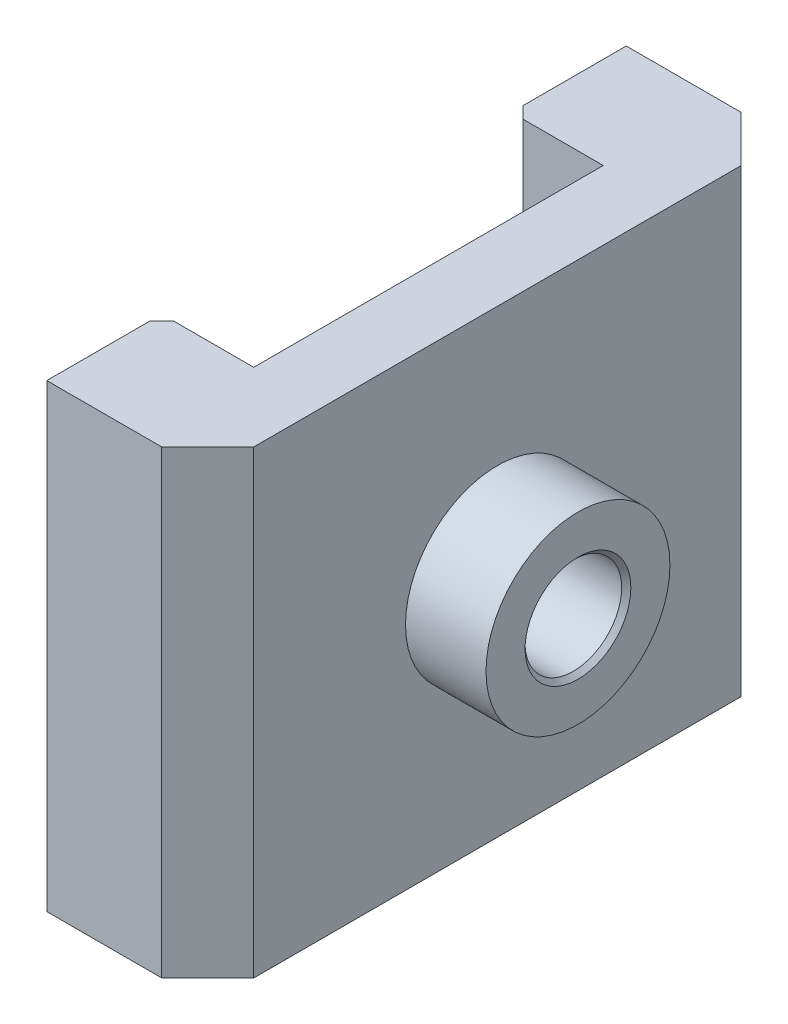
ISO-10303-21;
HEADER;
FILE_DESCRIPTION(('STEP AP214'),'2;1');
FILE_NAME('part.step','',(''),(''),'','','');
FILE_SCHEMA(('AUTOMOTIVE_DESIGN { 1 0 10303 214 1 1 1 1 }'));
ENDSEC;
DATA;
#1=APPLICATION_CONTEXT('core data for automotive mechanical design processes');
#2=APPLICATION_PROTOCOL_DEFINITION('international standard','automotive_design',2000,#1);
#3=PRODUCT_CONTEXT('',#1,'mechanical');
#4=PRODUCT('Part','Part','',(#3));
#5=PRODUCT_RELATED_PRODUCT_CATEGORY('part','',(#4));
#6=PRODUCT_DEFINITION_FORMATION('','',#4);
#7=PRODUCT_DEFINITION_CONTEXT('part definition',#1,'design');
#8=PRODUCT_DEFINITION('design','',#6,#7);
#9=PRODUCT_DEFINITION_SHAPE('','',#8);
#10=(LENGTH_UNIT() NAMED_UNIT(*) SI_UNIT(.MILLI.,.METRE.));
#11=(NAMED_UNIT(*) PLANE_ANGLE_UNIT() SI_UNIT($,.RADIAN.));
#12=(NAMED_UNIT(*) SI_UNIT($,.STERADIAN.) SOLID_ANGLE_UNIT());
#13=UNCERTAINTY_MEASURE_WITH_UNIT(LENGTH_MEASURE(1.E-05),#10,'distance_accuracy_value','');
#14=(GEOMETRIC_REPRESENTATION_CONTEXT(3) GLOBAL_UNCERTAINTY_ASSIGNED_CONTEXT((#13)) GLOBAL_UNIT_ASSIGNED_CONTEXT((#10,
#11,#12)) REPRESENTATION_CONTEXT('',''));
#15=CARTESIAN_POINT('',(0.,0.,0.));
#16=DIRECTION('',(0.,0.,1.));
#17=DIRECTION('',(1.,0.,0.));
#18=AXIS2_PLACEMENT_3D('',#15,#16,#17);
#19=CARTESIAN_POINT('',(-7.,20.,-7.6));
#20=DIRECTION('',(1.,0.,0.));
#21=DIRECTION('',(0.,0.,-1.));
#22=AXIS2_PLACEMENT_3D('',#19,#20,#21);
#23=PLANE('',#22);
#24=DIRECTION('',(0.,0.,1.));
#25=VECTOR('',#24,1.);
#26=CARTESIAN_POINT('',(-7.,0.,-7.6));
#27=LINE('',#26,#25);
#28=CARTESIAN_POINT('',(-7.,0.,-12.6));
#29=VERTEX_POINT('',#28);
#30=CARTESIAN_POINT('',(-7.,0.,-8.1));
#31=VERTEX_POINT('',#30);
#32=EDGE_CURVE('E164',#29,#31,#27,.T.);
#33=ORIENTED_EDGE('',*,*,#32,.T.);
#34=DIRECTION('',(0.,1.,0.));
#35=VECTOR('',#34,1.);
#36=CARTESIAN_POINT('',(-7.,20.,-8.1));
#37=LINE('',#36,#35);
#38=CARTESIAN_POINT('',(-7.,20.,-8.1));
#39=VERTEX_POINT('',#38);
#40=EDGE_CURVE('E221',#31,#39,#37,.T.);
#41=ORIENTED_EDGE('',*,*,#40,.T.);
#42=DIRECTION('',(0.,0.,1.));
#43=VECTOR('',#42,1.);
#44=CARTESIAN_POINT('',(-7.,20.,-7.6));
#45=LINE('',#44,#43);
#46=CARTESIAN_POINT('',(-7.,20.,-12.6));
#47=VERTEX_POINT('',#46);
#48=EDGE_CURVE('E134',#47,#39,#45,.T.);
#49=ORIENTED_EDGE('',*,*,#48,.F.);
#50=DIRECTION('',(0.,-1.,0.));
#51=VECTOR('',#50,1.);
#52=CARTESIAN_POINT('',(-7.,20.,-12.6));
#53=LINE('',#52,#51);
#54=EDGE_CURVE('E163',#47,#29,#53,.T.);
#55=ORIENTED_EDGE('',*,*,#54,.T.);
#56=EDGE_LOOP('',(#33,#41,#49,#55));
#57=FACE_BOUND('',#56,.T.);
#58=ADVANCED_FACE('F35',(#57),#23,.F.);
#59=CARTESIAN_POINT('',(-3.,20.,-7.6));
#60=DIRECTION('',(0.,0.,-1.));
#61=DIRECTION('',(-1.,0.,0.));
#62=AXIS2_PLACEMENT_3D('',#59,#60,#61);
#63=PLANE('',#62);
#64=DIRECTION('',(1.,0.,0.));
#65=VECTOR('',#64,1.);
#66=CARTESIAN_POINT('',(-3.,20.,-7.6));
#67=LINE('',#66,#65);
#68=CARTESIAN_POINT('',(-6.49999999999999,20.,-7.6));
#69=VERTEX_POINT('',#68);
#70=CARTESIAN_POINT('',(-3.,20.,-7.6));
#71=VERTEX_POINT('',#70);
#72=EDGE_CURVE('E122',#69,#71,#67,.T.);
#73=ORIENTED_EDGE('',*,*,#72,.F.);
#74=DIRECTION('',(0.,-1.,0.));
#75=VECTOR('',#74,1.);
#76=CARTESIAN_POINT('',(-6.49999999999999,20.,-7.6));
#77=LINE('',#76,#75);
#78=CARTESIAN_POINT('',(-6.49999999999999,0.,-7.6));
#79=VERTEX_POINT('',#78);
#80=EDGE_CURVE('E215',#69,#79,#77,.T.);
#81=ORIENTED_EDGE('',*,*,#80,.T.);
#82=DIRECTION('',(1.,0.,0.));
#83=VECTOR('',#82,1.);
#84=CARTESIAN_POINT('',(-3.,0.,-7.6));
#85=LINE('',#84,#83);
#86=CARTESIAN_POINT('',(-3.,0.,-7.6));
#87=VERTEX_POINT('',#86);
#88=EDGE_CURVE('E140',#79,#87,#85,.T.);
#89=ORIENTED_EDGE('',*,*,#88,.T.);
#90=DIRECTION('',(0.,-1.,0.));
#91=VECTOR('',#90,1.);
#92=CARTESIAN_POINT('',(-3.,20.,-7.6));
#93=LINE('',#92,#91);
#94=EDGE_CURVE('E137',#71,#87,#93,.T.);
#95=ORIENTED_EDGE('',*,*,#94,.F.);
#96=EDGE_LOOP('',(#73,#81,#89,#95));
#97=FACE_BOUND('',#96,.T.);
#98=ADVANCED_FACE('F138',(#97),#63,.F.);
#99=CARTESIAN_POINT('',(-3.,20.,7.6));
#100=DIRECTION('',(1.,0.,0.));
#101=DIRECTION('',(0.,0.,-1.));
#102=AXIS2_PLACEMENT_3D('',#99,#100,#101);
#103=PLANE('',#102);
#104=CARTESIAN_POINT('',(-3.,10.,0.));
#105=DIRECTION('',(1.,0.,0.));
#106=DIRECTION('',(0.,0.,-1.));
#107=AXIS2_PLACEMENT_3D('',#104,#105,#106);
#108=CIRCLE('',#107,2.1);
#109=CARTESIAN_POINT('',(-3.,10.,-2.1));
#110=VERTEX_POINT('',#109);
#111=EDGE_CURVE('E264',#110,#110,#108,.T.);
#112=ORIENTED_EDGE('',*,*,#111,.T.);
#113=EDGE_LOOP('',(#112));
#114=FACE_BOUND('',#113,.T.);
#115=DIRECTION('',(0.,0.,1.));
#116=VECTOR('',#115,1.);
#117=CARTESIAN_POINT('',(-3.,0.,7.6));
#118=LINE('',#117,#116);
#119=CARTESIAN_POINT('',(-3.,0.,7.6));
#120=VERTEX_POINT('',#119);
#121=EDGE_CURVE('E169',#87,#120,#118,.T.);
#122=ORIENTED_EDGE('',*,*,#121,.T.);
#123=DIRECTION('',(0.,-1.,0.));
#124=VECTOR('',#123,1.);
#125=CARTESIAN_POINT('',(-3.,20.,7.6));
#126=LINE('',#125,#124);
#127=CARTESIAN_POINT('',(-3.,20.,7.6));
#128=VERTEX_POINT('',#127);
#129=EDGE_CURVE('E144',#128,#120,#126,.T.);
#130=ORIENTED_EDGE('',*,*,#129,.F.);
#131=DIRECTION('',(0.,0.,1.));
#132=VECTOR('',#131,1.);
#133=CARTESIAN_POINT('',(-3.,20.,7.6));
#134=LINE('',#133,#132);
#135=EDGE_CURVE('E127',#71,#128,#134,.T.);
#136=ORIENTED_EDGE('',*,*,#135,.F.);
#137=ORIENTED_EDGE('',*,*,#94,.T.);
#138=EDGE_LOOP('',(#122,#130,#136,#137));
#139=FACE_BOUND('',#138,.T.);
#140=ADVANCED_FACE('F146',(#114,#139),#103,.F.);
#141=CARTESIAN_POINT('',(-7.,20.,7.6));
#142=DIRECTION('',(0.,0.,1.));
#143=DIRECTION('',(1.,0.,0.));
#144=AXIS2_PLACEMENT_3D('',#141,#142,#143);
#145=PLANE('',#144);
#146=DIRECTION('',(-1.,0.,0.));
#147=VECTOR('',#146,1.);
#148=CARTESIAN_POINT('',(-7.,0.,7.6));
#149=LINE('',#148,#147);
#150=CARTESIAN_POINT('',(-6.49999999999999,0.,7.6));
#151=VERTEX_POINT('',#150);
#152=EDGE_CURVE('E171',#120,#151,#149,.T.);
#153=ORIENTED_EDGE('',*,*,#152,.T.);
#154=DIRECTION('',(0.,1.,0.));
#155=VECTOR('',#154,1.);
#156=CARTESIAN_POINT('',(-6.49999999999999,20.,7.6));
#157=LINE('',#156,#155);
#158=CARTESIAN_POINT('',(-6.49999999999999,20.,7.6));
#159=VERTEX_POINT('',#158);
#160=EDGE_CURVE('E11',#151,#159,#157,.T.);
#161=ORIENTED_EDGE('',*,*,#160,.T.);
#162=DIRECTION('',(-1.,0.,0.));
#163=VECTOR('',#162,1.);
#164=CARTESIAN_POINT('',(-7.,20.,7.6));
#165=LINE('',#164,#163);
#166=EDGE_CURVE('E148',#128,#159,#165,.T.);
#167=ORIENTED_EDGE('',*,*,#166,.F.);
#168=ORIENTED_EDGE('',*,*,#129,.T.);
#169=EDGE_LOOP('',(#153,#161,#167,#168));
#170=FACE_BOUND('',#169,.T.);
#171=ADVANCED_FACE('F301',(#170),#145,.F.);
#172=CARTESIAN_POINT('',(-7.,20.,12.6));
#173=DIRECTION('',(1.,0.,0.));
#174=DIRECTION('',(0.,0.,-1.));
#175=AXIS2_PLACEMENT_3D('',#172,#173,#174);
#176=PLANE('',#175);
#177=DIRECTION('',(0.,0.,1.));
#178=VECTOR('',#177,1.);
#179=CARTESIAN_POINT('',(-7.,20.,12.6));
#180=LINE('',#179,#178);
#181=CARTESIAN_POINT('',(-7.,20.,8.10000000000001));
#182=VERTEX_POINT('',#181);
#183=CARTESIAN_POINT('',(-7.,20.,12.6));
#184=VERTEX_POINT('',#183);
#185=EDGE_CURVE('E150',#182,#184,#180,.T.);
#186=ORIENTED_EDGE('',*,*,#185,.F.);
#187=DIRECTION('',(0.,-1.,0.));
#188=VECTOR('',#187,1.);
#189=CARTESIAN_POINT('',(-7.,20.,8.10000000000001));
#190=LINE('',#189,#188);
#191=CARTESIAN_POINT('',(-7.,0.,8.10000000000001));
#192=VERTEX_POINT('',#191);
#193=EDGE_CURVE('E43',#182,#192,#190,.T.);
#194=ORIENTED_EDGE('',*,*,#193,.T.);
#195=DIRECTION('',(0.,0.,1.));
#196=VECTOR('',#195,1.);
#197=CARTESIAN_POINT('',(-7.,0.,12.6));
#198=LINE('',#197,#196);
#199=CARTESIAN_POINT('',(-7.,0.,12.6));
#200=VERTEX_POINT('',#199);
#201=EDGE_CURVE('E173',#192,#200,#198,.T.);
#202=ORIENTED_EDGE('',*,*,#201,.T.);
#203=DIRECTION('',(0.,-1.,0.));
#204=VECTOR('',#203,1.);
#205=CARTESIAN_POINT('',(-7.,20.,12.6));
#206=LINE('',#205,#204);
#207=EDGE_CURVE('E185',#184,#200,#206,.T.);
#208=ORIENTED_EDGE('',*,*,#207,.F.);
#209=EDGE_LOOP('',(#186,#194,#202,#208));
#210=FACE_BOUND('',#209,.T.);
#211=ADVANCED_FACE('F228',(#210),#176,.F.);
#212=CARTESIAN_POINT('',(0.,20.,12.6));
#213=DIRECTION('',(0.,0.,-1.));
#214=DIRECTION('',(-1.,0.,0.));
#215=AXIS2_PLACEMENT_3D('',#212,#213,#214);
#216=PLANE('',#215);
#217=DIRECTION('',(1.,0.,0.));
#218=VECTOR('',#217,1.);
#219=CARTESIAN_POINT('',(0.,0.,12.6));
#220=LINE('',#219,#218);
#221=CARTESIAN_POINT('',(-2.00000000000001,0.,12.6));
#222=VERTEX_POINT('',#221);
#223=EDGE_CURVE('E175',#200,#222,#220,.T.);
#224=ORIENTED_EDGE('',*,*,#223,.T.);
#225=DIRECTION('',(0.,1.,0.));
#226=VECTOR('',#225,1.);
#227=CARTESIAN_POINT('',(-2.00000000000001,20.,12.6));
#228=LINE('',#227,#226);
#229=CARTESIAN_POINT('',(-2.00000000000001,20.,12.6));
#230=VERTEX_POINT('',#229);
#231=EDGE_CURVE('E204',#222,#230,#228,.T.);
#232=ORIENTED_EDGE('',*,*,#231,.T.);
#233=DIRECTION('',(1.,0.,0.));
#234=VECTOR('',#233,1.);
#235=CARTESIAN_POINT('',(0.,20.,12.6));
#236=LINE('',#235,#234);
#237=EDGE_CURVE('E155',#184,#230,#236,.T.);
#238=ORIENTED_EDGE('',*,*,#237,.F.);
#239=ORIENTED_EDGE('',*,*,#207,.T.);
#240=EDGE_LOOP('',(#224,#232,#238,#239));
#241=FACE_BOUND('',#240,.T.);
#242=ADVANCED_FACE('F238',(#241),#216,.F.);
#243=CARTESIAN_POINT('',(0.,20.,-12.6));
#244=DIRECTION('',(-1.,0.,0.));
#245=DIRECTION('',(0.,0.,1.));
#246=AXIS2_PLACEMENT_3D('',#243,#244,#245);
#247=PLANE('',#246);
#248=CARTESIAN_POINT('',(0.,10.,0.));
#249=DIRECTION('',(-1.,0.,0.));
#250=DIRECTION('',(0.,0.,1.));
#251=AXIS2_PLACEMENT_3D('',#248,#249,#250);
#252=CIRCLE('',#251,4.);
#253=CARTESIAN_POINT('',(0.,10.,4.));
#254=VERTEX_POINT('',#253);
#255=EDGE_CURVE('E206',#254,#254,#252,.F.);
#256=ORIENTED_EDGE('',*,*,#255,.F.);
#257=EDGE_LOOP('',(#256));
#258=FACE_BOUND('',#257,.T.);
#259=DIRECTION('',(0.,0.,-1.));
#260=VECTOR('',#259,1.);
#261=CARTESIAN_POINT('',(0.,0.,-12.6));
#262=LINE('',#261,#260);
#263=CARTESIAN_POINT('',(0.,0.,10.6));
#264=VERTEX_POINT('',#263);
#265=CARTESIAN_POINT('',(0.,0.,-10.6));
#266=VERTEX_POINT('',#265);
#267=EDGE_CURVE('E178',#264,#266,#262,.T.);
#268=ORIENTED_EDGE('',*,*,#267,.T.);
#269=DIRECTION('',(0.,1.,0.));
#270=VECTOR('',#269,1.);
#271=CARTESIAN_POINT('',(0.,20.,-10.6));
#272=LINE('',#271,#270);
#273=CARTESIAN_POINT('',(0.,20.,-10.6));
#274=VERTEX_POINT('',#273);
#275=EDGE_CURVE('E198',#266,#274,#272,.T.);
#276=ORIENTED_EDGE('',*,*,#275,.T.);
#277=DIRECTION('',(0.,0.,-1.));
#278=VECTOR('',#277,1.);
#279=CARTESIAN_POINT('',(0.,20.,-12.6));
#280=LINE('',#279,#278);
#281=CARTESIAN_POINT('',(0.,20.,10.6));
#282=VERTEX_POINT('',#281);
#283=EDGE_CURVE('E158',#282,#274,#280,.T.);
#284=ORIENTED_EDGE('',*,*,#283,.F.);
#285=DIRECTION('',(0.,-1.,0.));
#286=VECTOR('',#285,1.);
#287=CARTESIAN_POINT('',(0.,20.,10.6));
#288=LINE('',#287,#286);
#289=EDGE_CURVE('E195',#282,#264,#288,.T.);
#290=ORIENTED_EDGE('',*,*,#289,.T.);
#291=EDGE_LOOP('',(#268,#276,#284,#290));
#292=FACE_BOUND('',#291,.T.);
#293=ADVANCED_FACE('F247',(#258,#292),#247,.F.);
#294=CARTESIAN_POINT('',(-7.,20.,-12.6));
#295=DIRECTION('',(0.,0.,1.));
#296=DIRECTION('',(1.,0.,0.));
#297=AXIS2_PLACEMENT_3D('',#294,#295,#296);
#298=PLANE('',#297);
#299=DIRECTION('',(-1.,0.,0.));
#300=VECTOR('',#299,1.);
#301=CARTESIAN_POINT('',(-7.,20.,-12.6));
#302=LINE('',#301,#300);
#303=CARTESIAN_POINT('',(-2.,20.,-12.6));
#304=VERTEX_POINT('',#303);
#305=EDGE_CURVE('E161',#304,#47,#302,.T.);
#306=ORIENTED_EDGE('',*,*,#305,.F.);
#307=DIRECTION('',(0.,-1.,0.));
#308=VECTOR('',#307,1.);
#309=CARTESIAN_POINT('',(-2.,20.,-12.6));
#310=LINE('',#309,#308);
#311=CARTESIAN_POINT('',(-2.,0.,-12.6));
#312=VERTEX_POINT('',#311);
#313=EDGE_CURVE('E143',#304,#312,#310,.T.);
#314=ORIENTED_EDGE('',*,*,#313,.T.);
#315=DIRECTION('',(-1.,0.,0.));
#316=VECTOR('',#315,1.);
#317=CARTESIAN_POINT('',(-7.,0.,-12.6));
#318=LINE('',#317,#316);
#319=EDGE_CURVE('E181',#312,#29,#318,.T.);
#320=ORIENTED_EDGE('',*,*,#319,.T.);
#321=ORIENTED_EDGE('',*,*,#54,.F.);
#322=EDGE_LOOP('',(#306,#314,#320,#321));
#323=FACE_BOUND('',#322,.T.);
#324=ADVANCED_FACE('F255',(#323),#298,.F.);
#325=CARTESIAN_POINT('',(0.,20.,0.));
#326=DIRECTION('',(0.,-1.,0.));
#327=DIRECTION('',(0.,0.,-1.));
#328=AXIS2_PLACEMENT_3D('',#325,#326,#327);
#329=PLANE('',#328);
#330=ORIENTED_EDGE('',*,*,#48,.T.);
#331=DIRECTION('',(-0.707106781186548,0.,-0.707106781186547));
#332=VECTOR('',#331,1.);
#333=CARTESIAN_POINT('',(-6.49999999999999,20.,-7.6));
#334=LINE('',#333,#332);
#335=EDGE_CURVE('E130',#39,#69,#334,.F.);
#336=ORIENTED_EDGE('',*,*,#335,.T.);
#337=ORIENTED_EDGE('',*,*,#72,.T.);
#338=ORIENTED_EDGE('',*,*,#135,.T.);
#339=ORIENTED_EDGE('',*,*,#166,.T.);
#340=DIRECTION('',(0.707106781186548,0.,-0.707106781186547));
#341=VECTOR('',#340,1.);
#342=CARTESIAN_POINT('',(-7.,20.,8.10000000000001));
#343=LINE('',#342,#341);
#344=EDGE_CURVE('E50',#159,#182,#343,.F.);
#345=ORIENTED_EDGE('',*,*,#344,.T.);
#346=ORIENTED_EDGE('',*,*,#185,.T.);
#347=ORIENTED_EDGE('',*,*,#237,.T.);
#348=DIRECTION('',(-0.707106781186548,0.,0.707106781186547));
#349=VECTOR('',#348,1.);
#350=CARTESIAN_POINT('',(0.,20.,10.6));
#351=LINE('',#350,#349);
#352=EDGE_CURVE('E200',#230,#282,#351,.F.);
#353=ORIENTED_EDGE('',*,*,#352,.T.);
#354=ORIENTED_EDGE('',*,*,#283,.T.);
#355=DIRECTION('',(0.707106781186547,0.,0.707106781186548));
#356=VECTOR('',#355,1.);
#357=CARTESIAN_POINT('',(-2.,20.,-12.6));
#358=LINE('',#357,#356);
#359=EDGE_CURVE('E202',#274,#304,#358,.F.);
#360=ORIENTED_EDGE('',*,*,#359,.T.);
#361=ORIENTED_EDGE('',*,*,#305,.T.);
#362=EDGE_LOOP('',(#330,#336,#337,#338,#339,#345,#346,#347,#353,#354,#360,#361));
#363=FACE_BOUND('',#362,.T.);
#364=ADVANCED_FACE('F125',(#363),#329,.F.);
#365=CARTESIAN_POINT('',(0.,0.,0.));
#366=DIRECTION('',(0.,-1.,0.));
#367=DIRECTION('',(0.,0.,-1.));
#368=AXIS2_PLACEMENT_3D('',#365,#366,#367);
#369=PLANE('',#368);
#370=ORIENTED_EDGE('',*,*,#88,.F.);
#371=DIRECTION('',(0.707106781186548,0.,0.707106781186547));
#372=VECTOR('',#371,1.);
#373=CARTESIAN_POINT('',(0.550000000000009,0.,-0.55000000000001));
#374=LINE('',#373,#372);
#375=EDGE_CURVE('E219',#79,#31,#374,.F.);
#376=ORIENTED_EDGE('',*,*,#375,.T.);
#377=ORIENTED_EDGE('',*,*,#32,.F.);
#378=ORIENTED_EDGE('',*,*,#319,.F.);
#379=DIRECTION('',(-0.707106781186547,0.,-0.707106781186548));
#380=VECTOR('',#379,1.);
#381=CARTESIAN_POINT('',(5.3,0.,-5.29999999999999));
#382=LINE('',#381,#380);
#383=EDGE_CURVE('E193',#312,#266,#382,.F.);
#384=ORIENTED_EDGE('',*,*,#383,.T.);
#385=ORIENTED_EDGE('',*,*,#267,.F.);
#386=DIRECTION('',(0.707106781186548,0.,-0.707106781186547));
#387=VECTOR('',#386,1.);
#388=CARTESIAN_POINT('',(5.3,0.,5.30000000000001));
#389=LINE('',#388,#387);
#390=EDGE_CURVE('E191',#264,#222,#389,.F.);
#391=ORIENTED_EDGE('',*,*,#390,.T.);
#392=ORIENTED_EDGE('',*,*,#223,.F.);
#393=ORIENTED_EDGE('',*,*,#201,.F.);
#394=DIRECTION('',(-0.707106781186548,0.,0.707106781186547));
#395=VECTOR('',#394,1.);
#396=CARTESIAN_POINT('',(0.550000000000011,0.,0.550000000000011));
#397=LINE('',#396,#395);
#398=EDGE_CURVE('E217',#192,#151,#397,.F.);
#399=ORIENTED_EDGE('',*,*,#398,.T.);
#400=ORIENTED_EDGE('',*,*,#152,.F.);
#401=ORIENTED_EDGE('',*,*,#121,.F.);
#402=EDGE_LOOP('',(#370,#376,#377,#378,#384,#385,#391,#392,#393,#399,#400,#401));
#403=FACE_BOUND('',#402,.T.);
#404=ADVANCED_FACE('F233',(#403),#369,.T.);
#405=CARTESIAN_POINT('',(-2.,20.,-12.6));
#406=DIRECTION('',(-0.707106781186548,0.,0.707106781186547));
#407=DIRECTION('',(0.,-1.,0.));
#408=AXIS2_PLACEMENT_3D('',#405,#406,#407);
#409=PLANE('',#408);
#410=ORIENTED_EDGE('',*,*,#359,.F.);
#411=ORIENTED_EDGE('',*,*,#275,.F.);
#412=ORIENTED_EDGE('',*,*,#383,.F.);
#413=ORIENTED_EDGE('',*,*,#313,.F.);
#414=EDGE_LOOP('',(#410,#411,#412,#413));
#415=FACE_BOUND('',#414,.T.);
#416=ADVANCED_FACE('F250',(#415),#409,.F.);
#417=CARTESIAN_POINT('',(0.,20.,10.6));
#418=DIRECTION('',(-0.707106781186547,0.,-0.707106781186548));
#419=DIRECTION('',(0.,-1.,0.));
#420=AXIS2_PLACEMENT_3D('',#417,#418,#419);
#421=PLANE('',#420);
#422=ORIENTED_EDGE('',*,*,#352,.F.);
#423=ORIENTED_EDGE('',*,*,#231,.F.);
#424=ORIENTED_EDGE('',*,*,#390,.F.);
#425=ORIENTED_EDGE('',*,*,#289,.F.);
#426=EDGE_LOOP('',(#422,#423,#424,#425));
#427=FACE_BOUND('',#426,.T.);
#428=ADVANCED_FACE('F242',(#427),#421,.F.);
#429=CARTESIAN_POINT('',(3.5,10.,0.));
#430=DIRECTION('',(-1.,0.,0.));
#431=DIRECTION('',(0.,0.,1.));
#432=AXIS2_PLACEMENT_3D('',#429,#430,#431);
#433=CYLINDRICAL_SURFACE('',#432,4.);
#434=CARTESIAN_POINT('',(3.5,10.,0.));
#435=DIRECTION('',(1.,0.,0.));
#436=DIRECTION('',(0.,0.,-1.));
#437=AXIS2_PLACEMENT_3D('',#434,#435,#436);
#438=CIRCLE('',#437,4.);
#439=CARTESIAN_POINT('',(3.5,10.,-4.));
#440=VERTEX_POINT('',#439);
#441=EDGE_CURVE('E167',#440,#440,#438,.T.);
#442=ORIENTED_EDGE('',*,*,#441,.F.);
#443=EDGE_LOOP('',(#442));
#444=FACE_BOUND('',#443,.T.);
#445=ORIENTED_EDGE('',*,*,#255,.T.);
#446=EDGE_LOOP('',(#445));
#447=FACE_BOUND('',#446,.T.);
#448=ADVANCED_FACE('F282',(#444,#447),#433,.T.);
#449=CARTESIAN_POINT('',(3.5,10.,0.));
#450=DIRECTION('',(1.,0.,0.));
#451=DIRECTION('',(0.,0.,-1.));
#452=AXIS2_PLACEMENT_3D('',#449,#450,#451);
#453=PLANE('',#452);
#454=CARTESIAN_POINT('',(3.5,10.,0.));
#455=DIRECTION('',(1.,0.,0.));
#456=DIRECTION('',(0.,0.,-1.));
#457=AXIS2_PLACEMENT_3D('',#454,#455,#456);
#458=CIRCLE('',#457,2.3);
#459=CARTESIAN_POINT('',(3.5,10.,-2.3));
#460=VERTEX_POINT('',#459);
#461=EDGE_CURVE('E212',#460,#460,#458,.F.);
#462=ORIENTED_EDGE('',*,*,#461,.T.);
#463=EDGE_LOOP('',(#462));
#464=FACE_BOUND('',#463,.T.);
#465=ORIENTED_EDGE('',*,*,#441,.T.);
#466=EDGE_LOOP('',(#465));
#467=FACE_BOUND('',#466,.T.);
#468=ADVANCED_FACE('F272',(#464,#467),#453,.T.);
#469=CARTESIAN_POINT('',(-7.,10.,0.));
#470=DIRECTION('',(1.,0.,0.));
#471=DIRECTION('',(0.,0.,-1.));
#472=AXIS2_PLACEMENT_3D('',#469,#470,#471);
#473=CYLINDRICAL_SURFACE('',#472,2.1);
#474=CARTESIAN_POINT('',(3.3,10.,0.));
#475=DIRECTION('',(1.,0.,0.));
#476=DIRECTION('',(0.,0.,-1.));
#477=AXIS2_PLACEMENT_3D('',#474,#475,#476);
#478=CIRCLE('',#477,2.1);
#479=CARTESIAN_POINT('',(3.3,10.,-2.1));
#480=VERTEX_POINT('',#479);
#481=EDGE_CURVE('E209',#480,#480,#478,.T.);
#482=ORIENTED_EDGE('',*,*,#481,.T.);
#483=EDGE_LOOP('',(#482));
#484=FACE_BOUND('',#483,.T.);
#485=ORIENTED_EDGE('',*,*,#111,.F.);
#486=EDGE_LOOP('',(#485));
#487=FACE_BOUND('',#486,.T.);
#488=ADVANCED_FACE('F269',(#484,#487),#473,.F.);
#489=CARTESIAN_POINT('',(3.3,10.,0.));
#490=DIRECTION('',(1.,0.,0.));
#491=DIRECTION('',(0.,0.,-1.));
#492=AXIS2_PLACEMENT_3D('',#489,#490,#491);
#493=CONICAL_SURFACE('',#492,2.1,0.785398163397447);
#494=ORIENTED_EDGE('',*,*,#461,.F.);
#495=EDGE_LOOP('',(#494));
#496=FACE_BOUND('',#495,.T.);
#497=ORIENTED_EDGE('',*,*,#481,.F.);
#498=EDGE_LOOP('',(#497));
#499=FACE_BOUND('',#498,.T.);
#500=ADVANCED_FACE('F271',(#496,#499),#493,.F.);
#501=CARTESIAN_POINT('',(-6.49999999999999,20.,-7.6));
#502=DIRECTION('',(0.707106781186547,0.,-0.707106781186548));
#503=DIRECTION('',(0.,-1.,0.));
#504=AXIS2_PLACEMENT_3D('',#501,#502,#503);
#505=PLANE('',#504);
#506=ORIENTED_EDGE('',*,*,#335,.F.);
#507=ORIENTED_EDGE('',*,*,#40,.F.);
#508=ORIENTED_EDGE('',*,*,#375,.F.);
#509=ORIENTED_EDGE('',*,*,#80,.F.);
#510=EDGE_LOOP('',(#506,#507,#508,#509));
#511=FACE_BOUND('',#510,.T.);
#512=ADVANCED_FACE('F279',(#511),#505,.F.);
#513=CARTESIAN_POINT('',(-7.,20.,8.10000000000001));
#514=DIRECTION('',(0.707106781186547,0.,0.707106781186548));
#515=DIRECTION('',(0.,-1.,0.));
#516=AXIS2_PLACEMENT_3D('',#513,#514,#515);
#517=PLANE('',#516);
#518=ORIENTED_EDGE('',*,*,#344,.F.);
#519=ORIENTED_EDGE('',*,*,#160,.F.);
#520=ORIENTED_EDGE('',*,*,#398,.F.);
#521=ORIENTED_EDGE('',*,*,#193,.F.);
#522=EDGE_LOOP('',(#518,#519,#520,#521));
#523=FACE_BOUND('',#522,.T.);
#524=ADVANCED_FACE('F37',(#523),#517,.F.);
#525=CLOSED_SHELL('',(#58,#98,#140,#171,#211,#242,#293,#324,#364,#404,#416,#428,#448,#468,#488,
#500,#512,#524));
#526=MANIFOLD_SOLID_BREP('B2',#525);
#527=ADVANCED_BREP_SHAPE_REPRESENTATION('',(#18,#526),#14);
#528=SHAPE_DEFINITION_REPRESENTATION(#9,#527);
ENDSEC;
END-ISO-10303-21;
